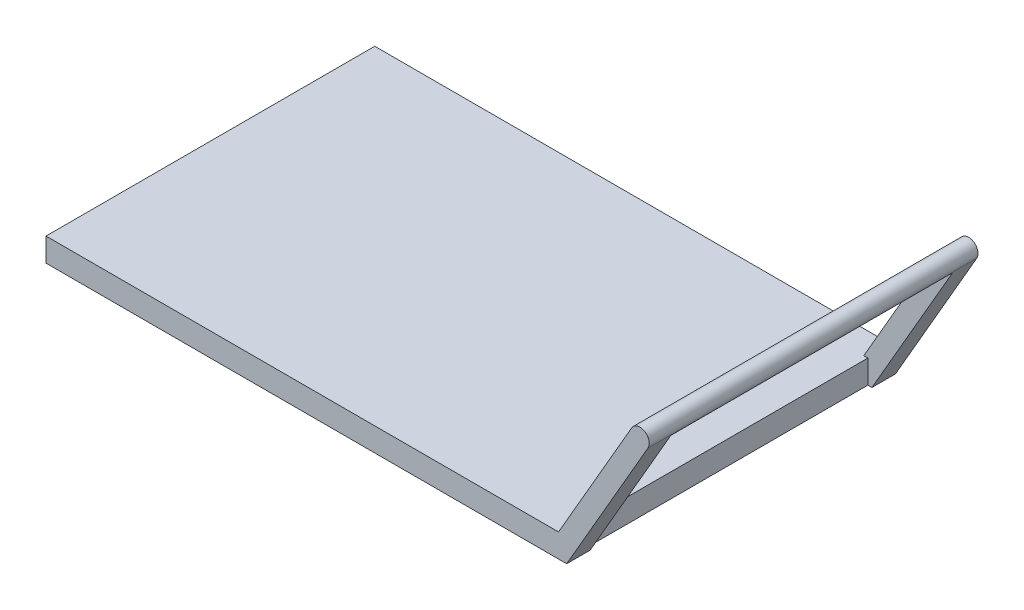
ISO-10303-21;
HEADER;
FILE_DESCRIPTION(('STEP AP214'),'2;1');
FILE_NAME('part.step','',(''),(''),'','','');
FILE_SCHEMA(('AUTOMOTIVE_DESIGN { 1 0 10303 214 1 1 1 1 }'));
ENDSEC;
DATA;
#1=APPLICATION_CONTEXT('core data for automotive mechanical design processes');
#2=APPLICATION_PROTOCOL_DEFINITION('international standard','automotive_design',2000,#1);
#3=PRODUCT_CONTEXT('',#1,'mechanical');
#4=PRODUCT('Part','Part','',(#3));
#5=PRODUCT_RELATED_PRODUCT_CATEGORY('part','',(#4));
#6=PRODUCT_DEFINITION_FORMATION('','',#4);
#7=PRODUCT_DEFINITION_CONTEXT('part definition',#1,'design');
#8=PRODUCT_DEFINITION('design','',#6,#7);
#9=PRODUCT_DEFINITION_SHAPE('','',#8);
#10=(LENGTH_UNIT() NAMED_UNIT(*) SI_UNIT(.MILLI.,.METRE.));
#11=(NAMED_UNIT(*) PLANE_ANGLE_UNIT() SI_UNIT($,.RADIAN.));
#12=(NAMED_UNIT(*) SI_UNIT($,.STERADIAN.) SOLID_ANGLE_UNIT());
#13=UNCERTAINTY_MEASURE_WITH_UNIT(LENGTH_MEASURE(1.E-05),#10,'distance_accuracy_value','');
#14=(GEOMETRIC_REPRESENTATION_CONTEXT(3) GLOBAL_UNCERTAINTY_ASSIGNED_CONTEXT((#13)) GLOBAL_UNIT_ASSIGNED_CONTEXT((#10,
#11,#12)) REPRESENTATION_CONTEXT('',''));
#15=CARTESIAN_POINT('',(0.,0.,0.));
#16=DIRECTION('',(0.,0.,1.));
#17=DIRECTION('',(1.,0.,0.));
#18=AXIS2_PLACEMENT_3D('',#15,#16,#17);
#19=CARTESIAN_POINT('',(55.,5.,35.));
#20=DIRECTION('',(-1.,0.,0.));
#21=DIRECTION('',(0.,0.,1.));
#22=AXIS2_PLACEMENT_3D('',#19,#20,#21);
#23=PLANE('',#22);
#24=DIRECTION('',(0.,1.,0.));
#25=VECTOR('',#24,1.);
#26=CARTESIAN_POINT('',(55.,0.,-30.));
#27=LINE('',#26,#25);
#28=CARTESIAN_POINT('',(55.,0.,-30.));
#29=VERTEX_POINT('',#28);
#30=CARTESIAN_POINT('',(55.,5.,-30.));
#31=VERTEX_POINT('',#30);
#32=EDGE_CURVE('E153',#29,#31,#27,.T.);
#33=ORIENTED_EDGE('',*,*,#32,.T.);
#34=DIRECTION('',(0.,0.,-1.));
#35=VECTOR('',#34,1.);
#36=CARTESIAN_POINT('',(55.,5.,35.));
#37=LINE('',#36,#35);
#38=CARTESIAN_POINT('',(55.,5.,30.));
#39=VERTEX_POINT('',#38);
#40=EDGE_CURVE('E185',#39,#31,#37,.T.);
#41=ORIENTED_EDGE('',*,*,#40,.F.);
#42=DIRECTION('',(0.,-1.,0.));
#43=VECTOR('',#42,1.);
#44=CARTESIAN_POINT('',(55.,5.,30.));
#45=LINE('',#44,#43);
#46=CARTESIAN_POINT('',(55.,0.,30.));
#47=VERTEX_POINT('',#46);
#48=EDGE_CURVE('E160',#39,#47,#45,.T.);
#49=ORIENTED_EDGE('',*,*,#48,.T.);
#50=DIRECTION('',(0.,0.,-1.));
#51=VECTOR('',#50,1.);
#52=CARTESIAN_POINT('',(55.,0.,35.));
#53=LINE('',#52,#51);
#54=EDGE_CURVE('E176',#47,#29,#53,.T.);
#55=ORIENTED_EDGE('',*,*,#54,.T.);
#56=EDGE_LOOP('',(#33,#41,#49,#55));
#57=FACE_BOUND('',#56,.T.);
#58=ADVANCED_FACE('F33',(#57),#23,.F.);
#59=CARTESIAN_POINT('',(-55.,5.,-35.));
#60=DIRECTION('',(0.,0.,1.));
#61=DIRECTION('',(1.,0.,0.));
#62=AXIS2_PLACEMENT_3D('',#59,#60,#61);
#63=PLANE('',#62);
#64=DIRECTION('',(0.500000000000001,0.866025403784438,0.));
#65=VECTOR('',#64,1.);
#66=CARTESIAN_POINT('',(54.1339745962156,5.,-35.));
#67=LINE('',#66,#65);
#68=CARTESIAN_POINT('',(54.1339745962156,5.,-35.));
#69=VERTEX_POINT('',#68);
#70=CARTESIAN_POINT('',(69.7224318643355,32.,-35.));
#71=VERTEX_POINT('',#70);
#72=EDGE_CURVE('E137',#69,#71,#67,.T.);
#73=ORIENTED_EDGE('',*,*,#72,.T.);
#74=CARTESIAN_POINT('',(71.4544826719044,31.,-35.));
#75=DIRECTION('',(0.,0.,1.));
#76=DIRECTION('',(1.,0.,0.));
#77=AXIS2_PLACEMENT_3D('',#74,#75,#76);
#78=CIRCLE('',#77,2.00000000000001);
#79=CARTESIAN_POINT('',(73.1865334794733,30.,-35.));
#80=VERTEX_POINT('',#79);
#81=EDGE_CURVE('E122',#71,#80,#78,.F.);
#82=ORIENTED_EDGE('',*,*,#81,.T.);
#83=DIRECTION('',(-0.500000000000001,-0.866025403784438,0.));
#84=VECTOR('',#83,1.);
#85=CARTESIAN_POINT('',(73.1865334794733,30.,-35.));
#86=LINE('',#85,#84);
#87=CARTESIAN_POINT('',(55.8660254037844,0.,-35.));
#88=VERTEX_POINT('',#87);
#89=EDGE_CURVE('E135',#80,#88,#86,.T.);
#90=ORIENTED_EDGE('',*,*,#89,.T.);
#91=DIRECTION('',(-1.,0.,0.));
#92=VECTOR('',#91,1.);
#93=CARTESIAN_POINT('',(-55.,0.,-35.));
#94=LINE('',#93,#92);
#95=CARTESIAN_POINT('',(-55.,0.,-35.));
#96=VERTEX_POINT('',#95);
#97=EDGE_CURVE('E196',#88,#96,#94,.T.);
#98=ORIENTED_EDGE('',*,*,#97,.T.);
#99=DIRECTION('',(0.,-1.,0.));
#100=VECTOR('',#99,1.);
#101=CARTESIAN_POINT('',(-55.,5.,-35.));
#102=LINE('',#101,#100);
#103=CARTESIAN_POINT('',(-55.,5.,-35.));
#104=VERTEX_POINT('',#103);
#105=EDGE_CURVE('E40',#104,#96,#102,.T.);
#106=ORIENTED_EDGE('',*,*,#105,.F.);
#107=DIRECTION('',(-1.,0.,0.));
#108=VECTOR('',#107,1.);
#109=CARTESIAN_POINT('',(-55.,5.,-35.));
#110=LINE('',#109,#108);
#111=EDGE_CURVE('E187',#69,#104,#110,.T.);
#112=ORIENTED_EDGE('',*,*,#111,.F.);
#113=EDGE_LOOP('',(#73,#82,#90,#98,#106,#112));
#114=FACE_BOUND('',#113,.T.);
#115=ADVANCED_FACE('F134',(#114),#63,.F.);
#116=CARTESIAN_POINT('',(-55.,5.,35.));
#117=DIRECTION('',(1.,0.,0.));
#118=DIRECTION('',(0.,0.,-1.));
#119=AXIS2_PLACEMENT_3D('',#116,#117,#118);
#120=PLANE('',#119);
#121=DIRECTION('',(0.,0.,1.));
#122=VECTOR('',#121,1.);
#123=CARTESIAN_POINT('',(-55.,0.,35.));
#124=LINE('',#123,#122);
#125=CARTESIAN_POINT('',(-55.,0.,35.));
#126=VERTEX_POINT('',#125);
#127=EDGE_CURVE('E198',#96,#126,#124,.T.);
#128=ORIENTED_EDGE('',*,*,#127,.T.);
#129=DIRECTION('',(0.,-1.,0.));
#130=VECTOR('',#129,1.);
#131=CARTESIAN_POINT('',(-55.,5.,35.));
#132=LINE('',#131,#130);
#133=CARTESIAN_POINT('',(-55.,5.,35.));
#134=VERTEX_POINT('',#133);
#135=EDGE_CURVE('E194',#134,#126,#132,.T.);
#136=ORIENTED_EDGE('',*,*,#135,.F.);
#137=DIRECTION('',(0.,0.,1.));
#138=VECTOR('',#137,1.);
#139=CARTESIAN_POINT('',(-55.,5.,35.));
#140=LINE('',#139,#138);
#141=EDGE_CURVE('E190',#104,#134,#140,.T.);
#142=ORIENTED_EDGE('',*,*,#141,.F.);
#143=ORIENTED_EDGE('',*,*,#105,.T.);
#144=EDGE_LOOP('',(#128,#136,#142,#143));
#145=FACE_BOUND('',#144,.T.);
#146=ADVANCED_FACE('F207',(#145),#120,.F.);
#147=CARTESIAN_POINT('',(-55.,5.,35.));
#148=DIRECTION('',(0.,0.,-1.));
#149=DIRECTION('',(-1.,0.,0.));
#150=AXIS2_PLACEMENT_3D('',#147,#148,#149);
#151=PLANE('',#150);
#152=DIRECTION('',(0.500000000000001,0.866025403784438,0.));
#153=VECTOR('',#152,1.);
#154=CARTESIAN_POINT('',(73.1865334794733,30.,35.));
#155=LINE('',#154,#153);
#156=CARTESIAN_POINT('',(55.8660254037844,0.,35.));
#157=VERTEX_POINT('',#156);
#158=CARTESIAN_POINT('',(73.1865334794733,30.,35.));
#159=VERTEX_POINT('',#158);
#160=EDGE_CURVE('E158',#157,#159,#155,.T.);
#161=ORIENTED_EDGE('',*,*,#160,.T.);
#162=CARTESIAN_POINT('',(71.4544826719044,31.,35.));
#163=DIRECTION('',(0.,0.,1.));
#164=DIRECTION('',(1.,0.,0.));
#165=AXIS2_PLACEMENT_3D('',#162,#163,#164);
#166=CIRCLE('',#165,2.00000000000001);
#167=CARTESIAN_POINT('',(69.7224318643355,32.,35.));
#168=VERTEX_POINT('',#167);
#169=EDGE_CURVE('E139',#159,#168,#166,.T.);
#170=ORIENTED_EDGE('',*,*,#169,.T.);
#171=DIRECTION('',(-0.500000000000001,-0.866025403784438,0.));
#172=VECTOR('',#171,1.);
#173=CARTESIAN_POINT('',(69.7224318643355,32.,35.));
#174=LINE('',#173,#172);
#175=CARTESIAN_POINT('',(54.1339745962156,5.,35.));
#176=VERTEX_POINT('',#175);
#177=EDGE_CURVE('E149',#168,#176,#174,.T.);
#178=ORIENTED_EDGE('',*,*,#177,.T.);
#179=DIRECTION('',(1.,0.,0.));
#180=VECTOR('',#179,1.);
#181=CARTESIAN_POINT('',(-55.,5.,35.));
#182=LINE('',#181,#180);
#183=EDGE_CURVE('E192',#134,#176,#182,.T.);
#184=ORIENTED_EDGE('',*,*,#183,.F.);
#185=ORIENTED_EDGE('',*,*,#135,.T.);
#186=DIRECTION('',(1.,0.,0.));
#187=VECTOR('',#186,1.);
#188=CARTESIAN_POINT('',(-55.,0.,35.));
#189=LINE('',#188,#187);
#190=EDGE_CURVE('E188',#126,#157,#189,.T.);
#191=ORIENTED_EDGE('',*,*,#190,.T.);
#192=EDGE_LOOP('',(#161,#170,#178,#184,#185,#191));
#193=FACE_BOUND('',#192,.T.);
#194=ADVANCED_FACE('F214',(#193),#151,.F.);
#195=CARTESIAN_POINT('',(0.,5.,0.));
#196=DIRECTION('',(0.,-1.,0.));
#197=DIRECTION('',(0.,0.,-1.));
#198=AXIS2_PLACEMENT_3D('',#195,#196,#197);
#199=PLANE('',#198);
#200=DIRECTION('',(-1.,0.,0.));
#201=VECTOR('',#200,1.);
#202=CARTESIAN_POINT('',(55.,5.,-30.));
#203=LINE('',#202,#201);
#204=CARTESIAN_POINT('',(54.1339745962156,5.,-30.));
#205=VERTEX_POINT('',#204);
#206=EDGE_CURVE('E47',#31,#205,#203,.T.);
#207=ORIENTED_EDGE('',*,*,#206,.T.);
#208=DIRECTION('',(0.,0.,-1.));
#209=VECTOR('',#208,1.);
#210=CARTESIAN_POINT('',(54.1339745962156,5.,-30.));
#211=LINE('',#210,#209);
#212=EDGE_CURVE('E51',#205,#69,#211,.T.);
#213=ORIENTED_EDGE('',*,*,#212,.T.);
#214=ORIENTED_EDGE('',*,*,#111,.T.);
#215=ORIENTED_EDGE('',*,*,#141,.T.);
#216=ORIENTED_EDGE('',*,*,#183,.T.);
#217=DIRECTION('',(0.,0.,1.));
#218=VECTOR('',#217,1.);
#219=CARTESIAN_POINT('',(54.1339745962156,5.,30.));
#220=LINE('',#219,#218);
#221=CARTESIAN_POINT('',(54.1339745962156,5.,30.));
#222=VERTEX_POINT('',#221);
#223=EDGE_CURVE('E169',#222,#176,#220,.T.);
#224=ORIENTED_EDGE('',*,*,#223,.F.);
#225=DIRECTION('',(1.,0.,0.));
#226=VECTOR('',#225,1.);
#227=CARTESIAN_POINT('',(54.1339745962156,5.,30.));
#228=LINE('',#227,#226);
#229=EDGE_CURVE('E157',#222,#39,#228,.T.);
#230=ORIENTED_EDGE('',*,*,#229,.T.);
#231=ORIENTED_EDGE('',*,*,#40,.T.);
#232=EDGE_LOOP('',(#207,#213,#214,#215,#216,#224,#230,#231));
#233=FACE_BOUND('',#232,.T.);
#234=ADVANCED_FACE('F218',(#233),#199,.F.);
#235=CARTESIAN_POINT('',(0.,0.,0.));
#236=DIRECTION('',(0.,-1.,0.));
#237=DIRECTION('',(0.,0.,-1.));
#238=AXIS2_PLACEMENT_3D('',#235,#236,#237);
#239=PLANE('',#238);
#240=ORIENTED_EDGE('',*,*,#54,.F.);
#241=DIRECTION('',(1.,0.,0.));
#242=VECTOR('',#241,1.);
#243=CARTESIAN_POINT('',(55.8660254037844,0.,30.));
#244=LINE('',#243,#242);
#245=CARTESIAN_POINT('',(55.8660254037844,0.,30.));
#246=VERTEX_POINT('',#245);
#247=EDGE_CURVE('E163',#47,#246,#244,.T.);
#248=ORIENTED_EDGE('',*,*,#247,.T.);
#249=DIRECTION('',(0.,0.,1.));
#250=VECTOR('',#249,1.);
#251=CARTESIAN_POINT('',(55.8660254037844,0.,30.));
#252=LINE('',#251,#250);
#253=EDGE_CURVE('E180',#246,#157,#252,.T.);
#254=ORIENTED_EDGE('',*,*,#253,.T.);
#255=ORIENTED_EDGE('',*,*,#190,.F.);
#256=ORIENTED_EDGE('',*,*,#127,.F.);
#257=ORIENTED_EDGE('',*,*,#97,.F.);
#258=DIRECTION('',(0.,0.,-1.));
#259=VECTOR('',#258,1.);
#260=CARTESIAN_POINT('',(55.8660254037844,0.,-30.));
#261=LINE('',#260,#259);
#262=CARTESIAN_POINT('',(55.8660254037844,0.,-30.));
#263=VERTEX_POINT('',#262);
#264=EDGE_CURVE('E128',#263,#88,#261,.T.);
#265=ORIENTED_EDGE('',*,*,#264,.F.);
#266=DIRECTION('',(-1.,0.,0.));
#267=VECTOR('',#266,1.);
#268=CARTESIAN_POINT('',(55.8660254037844,0.,-30.));
#269=LINE('',#268,#267);
#270=EDGE_CURVE('E236',#263,#29,#269,.T.);
#271=ORIENTED_EDGE('',*,*,#270,.T.);
#272=EDGE_LOOP('',(#240,#248,#254,#255,#256,#257,#265,#271));
#273=FACE_BOUND('',#272,.T.);
#274=ADVANCED_FACE('F211',(#273),#239,.T.);
#275=CARTESIAN_POINT('',(69.7224318643355,32.,30.));
#276=DIRECTION('',(-0.866025403784438,0.500000000000001,0.));
#277=DIRECTION('',(-0.500000000000001,-0.866025403784438,0.));
#278=AXIS2_PLACEMENT_3D('',#275,#276,#277);
#279=PLANE('',#278);
#280=ORIENTED_EDGE('',*,*,#177,.F.);
#281=DIRECTION('',(0.,0.,1.));
#282=VECTOR('',#281,1.);
#283=CARTESIAN_POINT('',(69.7224318643355,32.,30.));
#284=LINE('',#283,#282);
#285=CARTESIAN_POINT('',(69.7224318643355,32.,30.));
#286=VERTEX_POINT('',#285);
#287=EDGE_CURVE('E174',#286,#168,#284,.T.);
#288=ORIENTED_EDGE('',*,*,#287,.F.);
#289=DIRECTION('',(-0.500000000000001,-0.866025403784438,0.));
#290=VECTOR('',#289,1.);
#291=CARTESIAN_POINT('',(69.7224318643355,32.,30.));
#292=LINE('',#291,#290);
#293=EDGE_CURVE('E154',#286,#222,#292,.T.);
#294=ORIENTED_EDGE('',*,*,#293,.T.);
#295=ORIENTED_EDGE('',*,*,#223,.T.);
#296=EDGE_LOOP('',(#280,#288,#294,#295));
#297=FACE_BOUND('',#296,.T.);
#298=ADVANCED_FACE('F221',(#297),#279,.T.);
#299=CARTESIAN_POINT('',(73.1865334794733,30.,30.));
#300=DIRECTION('',(0.866025403784438,-0.500000000000001,0.));
#301=DIRECTION('',(0.500000000000001,0.866025403784438,0.));
#302=AXIS2_PLACEMENT_3D('',#299,#300,#301);
#303=PLANE('',#302);
#304=ORIENTED_EDGE('',*,*,#160,.F.);
#305=ORIENTED_EDGE('',*,*,#253,.F.);
#306=DIRECTION('',(0.500000000000001,0.866025403784438,0.));
#307=VECTOR('',#306,1.);
#308=CARTESIAN_POINT('',(73.1865334794733,30.,30.));
#309=LINE('',#308,#307);
#310=CARTESIAN_POINT('',(73.1865334794733,30.,30.));
#311=VERTEX_POINT('',#310);
#312=EDGE_CURVE('E166',#246,#311,#309,.T.);
#313=ORIENTED_EDGE('',*,*,#312,.T.);
#314=DIRECTION('',(0.,0.,1.));
#315=VECTOR('',#314,1.);
#316=CARTESIAN_POINT('',(73.1865334794733,30.,30.));
#317=LINE('',#316,#315);
#318=EDGE_CURVE('E177',#311,#159,#317,.T.);
#319=ORIENTED_EDGE('',*,*,#318,.T.);
#320=EDGE_LOOP('',(#304,#305,#313,#319));
#321=FACE_BOUND('',#320,.T.);
#322=ADVANCED_FACE('F246',(#321),#303,.T.);
#323=CARTESIAN_POINT('',(0.,0.,30.));
#324=DIRECTION('',(0.,0.,1.));
#325=DIRECTION('',(1.,0.,0.));
#326=AXIS2_PLACEMENT_3D('',#323,#324,#325);
#327=PLANE('',#326);
#328=ORIENTED_EDGE('',*,*,#293,.F.);
#329=CARTESIAN_POINT('',(71.4544826719044,31.,30.));
#330=DIRECTION('',(0.,0.,1.));
#331=DIRECTION('',(1.,0.,0.));
#332=AXIS2_PLACEMENT_3D('',#329,#330,#331);
#333=CIRCLE('',#332,2.00000000000001);
#334=EDGE_CURVE('E138',#286,#311,#333,.T.);
#335=ORIENTED_EDGE('',*,*,#334,.T.);
#336=ORIENTED_EDGE('',*,*,#312,.F.);
#337=ORIENTED_EDGE('',*,*,#247,.F.);
#338=ORIENTED_EDGE('',*,*,#48,.F.);
#339=ORIENTED_EDGE('',*,*,#229,.F.);
#340=EDGE_LOOP('',(#328,#335,#336,#337,#338,#339));
#341=FACE_BOUND('',#340,.T.);
#342=ADVANCED_FACE('F226',(#341),#327,.F.);
#343=CARTESIAN_POINT('',(73.1865334794733,30.,-30.));
#344=DIRECTION('',(0.866025403784438,-0.500000000000001,0.));
#345=DIRECTION('',(0.500000000000001,0.866025403784438,0.));
#346=AXIS2_PLACEMENT_3D('',#343,#344,#345);
#347=PLANE('',#346);
#348=ORIENTED_EDGE('',*,*,#89,.F.);
#349=DIRECTION('',(0.,0.,-1.));
#350=VECTOR('',#349,1.);
#351=CARTESIAN_POINT('',(73.1865334794733,30.,-30.));
#352=LINE('',#351,#350);
#353=CARTESIAN_POINT('',(73.1865334794733,30.,-30.));
#354=VERTEX_POINT('',#353);
#355=EDGE_CURVE('E119',#354,#80,#352,.T.);
#356=ORIENTED_EDGE('',*,*,#355,.F.);
#357=DIRECTION('',(-0.500000000000001,-0.866025403784438,0.));
#358=VECTOR('',#357,1.);
#359=CARTESIAN_POINT('',(73.1865334794733,30.,-30.));
#360=LINE('',#359,#358);
#361=EDGE_CURVE('E237',#354,#263,#360,.T.);
#362=ORIENTED_EDGE('',*,*,#361,.T.);
#363=ORIENTED_EDGE('',*,*,#264,.T.);
#364=EDGE_LOOP('',(#348,#356,#362,#363));
#365=FACE_BOUND('',#364,.T.);
#366=ADVANCED_FACE('F142',(#365),#347,.T.);
#367=CARTESIAN_POINT('',(54.1339745962156,5.,-30.));
#368=DIRECTION('',(-0.866025403784438,0.500000000000001,0.));
#369=DIRECTION('',(-0.500000000000001,-0.866025403784438,0.));
#370=AXIS2_PLACEMENT_3D('',#367,#368,#369);
#371=PLANE('',#370);
#372=ORIENTED_EDGE('',*,*,#72,.F.);
#373=ORIENTED_EDGE('',*,*,#212,.F.);
#374=DIRECTION('',(0.500000000000001,0.866025403784438,0.));
#375=VECTOR('',#374,1.);
#376=CARTESIAN_POINT('',(54.1339745962156,5.,-30.));
#377=LINE('',#376,#375);
#378=CARTESIAN_POINT('',(69.7224318643355,32.,-30.));
#379=VERTEX_POINT('',#378);
#380=EDGE_CURVE('E144',#205,#379,#377,.T.);
#381=ORIENTED_EDGE('',*,*,#380,.T.);
#382=DIRECTION('',(0.,0.,-1.));
#383=VECTOR('',#382,1.);
#384=CARTESIAN_POINT('',(69.7224318643355,32.,-30.));
#385=LINE('',#384,#383);
#386=EDGE_CURVE('E129',#379,#71,#385,.T.);
#387=ORIENTED_EDGE('',*,*,#386,.T.);
#388=EDGE_LOOP('',(#372,#373,#381,#387));
#389=FACE_BOUND('',#388,.T.);
#390=ADVANCED_FACE('F250',(#389),#371,.T.);
#391=CARTESIAN_POINT('',(0.,0.,-30.));
#392=DIRECTION('',(0.,0.,-1.));
#393=DIRECTION('',(-1.,0.,0.));
#394=AXIS2_PLACEMENT_3D('',#391,#392,#393);
#395=PLANE('',#394);
#396=ORIENTED_EDGE('',*,*,#361,.F.);
#397=CARTESIAN_POINT('',(71.4544826719044,31.,-30.));
#398=DIRECTION('',(0.,0.,-1.));
#399=DIRECTION('',(-1.,0.,0.));
#400=AXIS2_PLACEMENT_3D('',#397,#398,#399);
#401=CIRCLE('',#400,2.00000000000001);
#402=EDGE_CURVE('E11',#354,#379,#401,.T.);
#403=ORIENTED_EDGE('',*,*,#402,.T.);
#404=ORIENTED_EDGE('',*,*,#380,.F.);
#405=ORIENTED_EDGE('',*,*,#206,.F.);
#406=ORIENTED_EDGE('',*,*,#32,.F.);
#407=ORIENTED_EDGE('',*,*,#270,.F.);
#408=EDGE_LOOP('',(#396,#403,#404,#405,#406,#407));
#409=FACE_BOUND('',#408,.T.);
#410=ADVANCED_FACE('F247',(#409),#395,.F.);
#411=CARTESIAN_POINT('',(71.4544826719044,31.,-40.6568542494924));
#412=DIRECTION('',(0.,0.,1.));
#413=DIRECTION('',(1.,0.,0.));
#414=AXIS2_PLACEMENT_3D('',#411,#412,#413);
#415=CYLINDRICAL_SURFACE('',#414,2.00000000000001);
#416=ORIENTED_EDGE('',*,*,#334,.F.);
#417=ORIENTED_EDGE('',*,*,#287,.T.);
#418=ORIENTED_EDGE('',*,*,#169,.F.);
#419=ORIENTED_EDGE('',*,*,#318,.F.);
#420=EDGE_LOOP('',(#416,#417,#418,#419));
#421=FACE_BOUND('',#420,.T.);
#422=ORIENTED_EDGE('',*,*,#402,.F.);
#423=ORIENTED_EDGE('',*,*,#355,.T.);
#424=ORIENTED_EDGE('',*,*,#81,.F.);
#425=ORIENTED_EDGE('',*,*,#386,.F.);
#426=EDGE_LOOP('',(#422,#423,#424,#425));
#427=FACE_BOUND('',#426,.T.);
#428=ADVANCED_FACE('F121',(#421,#427),#415,.T.);
#429=CLOSED_SHELL('',(#58,#115,#146,#194,#234,#274,#298,#322,#342,#366,#390,#410,#428));
#430=MANIFOLD_SOLID_BREP('B2',#429);
#431=ADVANCED_BREP_SHAPE_REPRESENTATION('',(#18,#430),#14);
#432=SHAPE_DEFINITION_REPRESENTATION(#9,#431);
ENDSEC;
END-ISO-10303-21;
